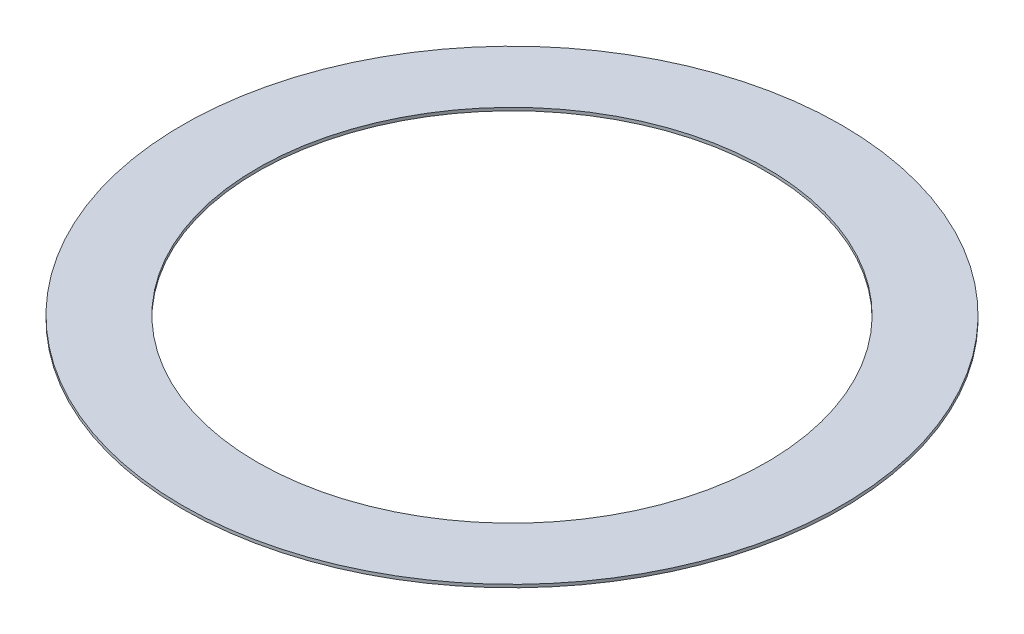
ISO-10303-21;
HEADER;
FILE_DESCRIPTION(('STEP AP214'),'2;1');
FILE_NAME('part.step','',(''),(''),'','','');
FILE_SCHEMA(('AUTOMOTIVE_DESIGN { 1 0 10303 214 1 1 1 1 }'));
ENDSEC;
DATA;
#1=APPLICATION_CONTEXT('core data for automotive mechanical design processes');
#2=APPLICATION_PROTOCOL_DEFINITION('international standard','automotive_design',2000,#1);
#3=PRODUCT_CONTEXT('',#1,'mechanical');
#4=PRODUCT('Part','Part','',(#3));
#5=PRODUCT_RELATED_PRODUCT_CATEGORY('part','',(#4));
#6=PRODUCT_DEFINITION_FORMATION('','',#4);
#7=PRODUCT_DEFINITION_CONTEXT('part definition',#1,'design');
#8=PRODUCT_DEFINITION('design','',#6,#7);
#9=PRODUCT_DEFINITION_SHAPE('','',#8);
#10=(LENGTH_UNIT() NAMED_UNIT(*) SI_UNIT(.MILLI.,.METRE.));
#11=(NAMED_UNIT(*) PLANE_ANGLE_UNIT() SI_UNIT($,.RADIAN.));
#12=(NAMED_UNIT(*) SI_UNIT($,.STERADIAN.) SOLID_ANGLE_UNIT());
#13=UNCERTAINTY_MEASURE_WITH_UNIT(LENGTH_MEASURE(1.E-05),#10,'distance_accuracy_value','');
#14=(GEOMETRIC_REPRESENTATION_CONTEXT(3) GLOBAL_UNCERTAINTY_ASSIGNED_CONTEXT((#13)) GLOBAL_UNIT_ASSIGNED_CONTEXT((#10,
#11,#12)) REPRESENTATION_CONTEXT('',''));
#15=CARTESIAN_POINT('',(0.,0.,0.));
#16=DIRECTION('',(0.,0.,1.));
#17=DIRECTION('',(1.,0.,0.));
#18=AXIS2_PLACEMENT_3D('',#15,#16,#17);
#19=CARTESIAN_POINT('',(0.,0.1,0.));
#20=DIRECTION('',(0.,1.,0.));
#21=DIRECTION('',(0.,0.,1.));
#22=AXIS2_PLACEMENT_3D('',#19,#20,#21);
#23=PLANE('',#22);
#24=CARTESIAN_POINT('',(0.,0.1,0.));
#25=DIRECTION('',(0.,1.,0.));
#26=DIRECTION('',(0.,0.,1.));
#27=AXIS2_PLACEMENT_3D('',#24,#25,#26);
#28=CIRCLE('',#27,11.);
#29=CARTESIAN_POINT('',(0.,0.1,11.));
#30=VERTEX_POINT('',#29);
#31=EDGE_CURVE('E10',#30,#30,#28,.T.);
#32=ORIENTED_EDGE('',*,*,#31,.T.);
#33=EDGE_LOOP('',(#32));
#34=FACE_BOUND('',#33,.T.);
#35=CARTESIAN_POINT('',(0.,0.1,0.));
#36=DIRECTION('',(0.,1.,0.));
#37=DIRECTION('',(0.,0.,1.));
#38=AXIS2_PLACEMENT_3D('',#35,#36,#37);
#39=CIRCLE('',#38,8.5);
#40=CARTESIAN_POINT('',(0.,0.1,8.5));
#41=VERTEX_POINT('',#40);
#42=EDGE_CURVE('E48',#41,#41,#39,.T.);
#43=ORIENTED_EDGE('',*,*,#42,.F.);
#44=EDGE_LOOP('',(#43));
#45=FACE_BOUND('',#44,.T.);
#46=ADVANCED_FACE('F37',(#34,#45),#23,.T.);
#47=CARTESIAN_POINT('',(0.,0.,0.));
#48=DIRECTION('',(0.,1.,0.));
#49=DIRECTION('',(0.,0.,1.));
#50=AXIS2_PLACEMENT_3D('',#47,#48,#49);
#51=PLANE('',#50);
#52=CARTESIAN_POINT('',(0.,0.,0.));
#53=DIRECTION('',(0.,1.,0.));
#54=DIRECTION('',(0.,0.,1.));
#55=AXIS2_PLACEMENT_3D('',#52,#53,#54);
#56=CIRCLE('',#55,11.);
#57=CARTESIAN_POINT('',(0.,0.,11.));
#58=VERTEX_POINT('',#57);
#59=EDGE_CURVE('E41',#58,#58,#56,.T.);
#60=ORIENTED_EDGE('',*,*,#59,.F.);
#61=EDGE_LOOP('',(#60));
#62=FACE_BOUND('',#61,.T.);
#63=CARTESIAN_POINT('',(0.,0.,0.));
#64=DIRECTION('',(0.,1.,0.));
#65=DIRECTION('',(0.,0.,1.));
#66=AXIS2_PLACEMENT_3D('',#63,#64,#65);
#67=CIRCLE('',#66,8.5);
#68=CARTESIAN_POINT('',(0.,0.,8.5));
#69=VERTEX_POINT('',#68);
#70=EDGE_CURVE('E50',#69,#69,#67,.T.);
#71=ORIENTED_EDGE('',*,*,#70,.T.);
#72=EDGE_LOOP('',(#71));
#73=FACE_BOUND('',#72,.T.);
#74=ADVANCED_FACE('F60',(#62,#73),#51,.F.);
#75=CARTESIAN_POINT('',(0.,0.1,0.));
#76=DIRECTION('',(0.,-1.,0.));
#77=DIRECTION('',(0.,0.,-1.));
#78=AXIS2_PLACEMENT_3D('',#75,#76,#77);
#79=CYLINDRICAL_SURFACE('',#78,11.);
#80=ORIENTED_EDGE('',*,*,#31,.F.);
#81=EDGE_LOOP('',(#80));
#82=FACE_BOUND('',#81,.T.);
#83=ORIENTED_EDGE('',*,*,#59,.T.);
#84=EDGE_LOOP('',(#83));
#85=FACE_BOUND('',#84,.T.);
#86=ADVANCED_FACE('F39',(#82,#85),#79,.T.);
#87=CARTESIAN_POINT('',(0.,0.1,0.));
#88=DIRECTION('',(0.,-1.,0.));
#89=DIRECTION('',(0.,0.,-1.));
#90=AXIS2_PLACEMENT_3D('',#87,#88,#89);
#91=CYLINDRICAL_SURFACE('',#90,8.5);
#92=ORIENTED_EDGE('',*,*,#42,.T.);
#93=EDGE_LOOP('',(#92));
#94=FACE_BOUND('',#93,.T.);
#95=ORIENTED_EDGE('',*,*,#70,.F.);
#96=EDGE_LOOP('',(#95));
#97=FACE_BOUND('',#96,.T.);
#98=ADVANCED_FACE('F56',(#94,#97),#91,.F.);
#99=CLOSED_SHELL('',(#46,#74,#86,#98));
#100=MANIFOLD_SOLID_BREP('B2',#99);
#101=ADVANCED_BREP_SHAPE_REPRESENTATION('',(#18,#100),#14);
#102=SHAPE_DEFINITION_REPRESENTATION(#9,#101);
ENDSEC;
END-ISO-10303-21;
